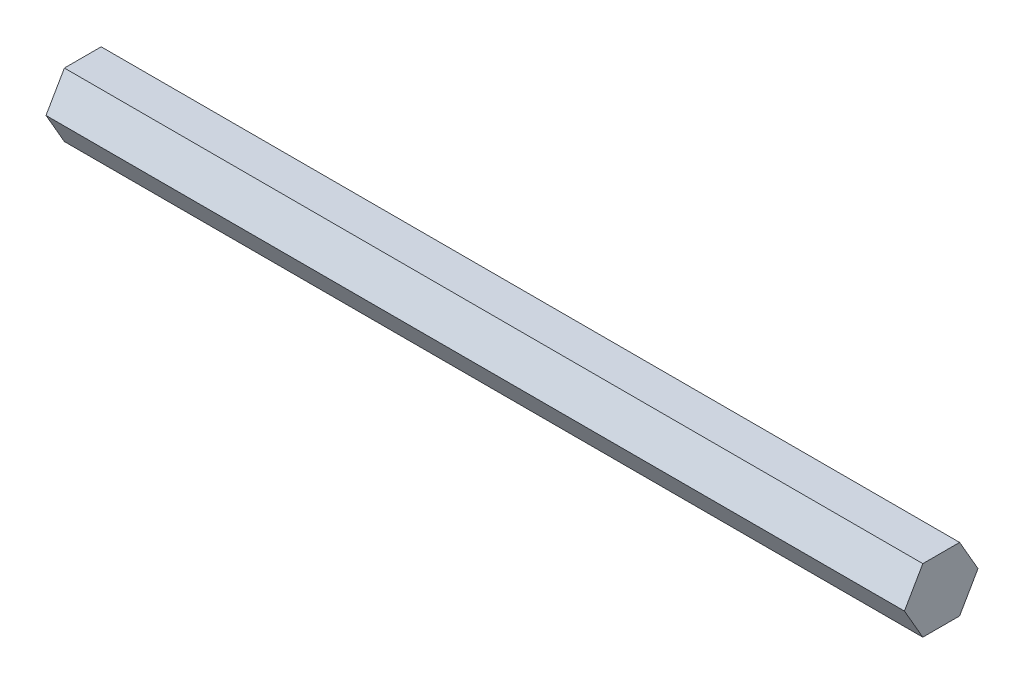
ISO-10303-21;
HEADER;
FILE_DESCRIPTION(('STEP AP214'),'2;1');
FILE_NAME('part.step','',(''),(''),'','','');
FILE_SCHEMA(('AUTOMOTIVE_DESIGN { 1 0 10303 214 1 1 1 1 }'));
ENDSEC;
DATA;
#1=APPLICATION_CONTEXT('core data for automotive mechanical design processes');
#2=APPLICATION_PROTOCOL_DEFINITION('international standard','automotive_design',2000,#1);
#3=PRODUCT_CONTEXT('',#1,'mechanical');
#4=PRODUCT('Part','Part','',(#3));
#5=PRODUCT_RELATED_PRODUCT_CATEGORY('part','',(#4));
#6=PRODUCT_DEFINITION_FORMATION('','',#4);
#7=PRODUCT_DEFINITION_CONTEXT('part definition',#1,'design');
#8=PRODUCT_DEFINITION('design','',#6,#7);
#9=PRODUCT_DEFINITION_SHAPE('','',#8);
#10=(LENGTH_UNIT() NAMED_UNIT(*) SI_UNIT(.MILLI.,.METRE.));
#11=(NAMED_UNIT(*) PLANE_ANGLE_UNIT() SI_UNIT($,.RADIAN.));
#12=(NAMED_UNIT(*) SI_UNIT($,.STERADIAN.) SOLID_ANGLE_UNIT());
#13=UNCERTAINTY_MEASURE_WITH_UNIT(LENGTH_MEASURE(1.E-05),#10,'distance_accuracy_value','');
#14=(GEOMETRIC_REPRESENTATION_CONTEXT(3) GLOBAL_UNCERTAINTY_ASSIGNED_CONTEXT((#13)) GLOBAL_UNIT_ASSIGNED_CONTEXT((#10,
#11,#12)) REPRESENTATION_CONTEXT('',''));
#15=CARTESIAN_POINT('',(0.,0.,0.));
#16=DIRECTION('',(0.,0.,1.));
#17=DIRECTION('',(1.,0.,0.));
#18=AXIS2_PLACEMENT_3D('',#15,#16,#17);
#19=CARTESIAN_POINT('',(171.45,-6.3627,-3.67350655777283));
#20=DIRECTION('',(0.,0.5,0.866025403784439));
#21=DIRECTION('',(0.,-0.866025403784439,0.5));
#22=AXIS2_PLACEMENT_3D('',#19,#20,#21);
#23=PLANE('',#22);
#24=DIRECTION('',(0.,0.866025403784439,-0.5));
#25=VECTOR('',#24,1.);
#26=CARTESIAN_POINT('',(0.,-6.3627,-3.67350655777283));
#27=LINE('',#26,#25);
#28=CARTESIAN_POINT('',(0.,-6.3627,-3.67350655777283));
#29=VERTEX_POINT('',#28);
#30=CARTESIAN_POINT('',(0.,0.,-7.34701311554566));
#31=VERTEX_POINT('',#30);
#32=EDGE_CURVE('E116',#29,#31,#27,.T.);
#33=ORIENTED_EDGE('',*,*,#32,.T.);
#34=DIRECTION('',(-1.,0.,0.));
#35=VECTOR('',#34,1.);
#36=CARTESIAN_POINT('',(171.45,0.,-7.34701311554566));
#37=LINE('',#36,#35);
#38=CARTESIAN_POINT('',(171.45,0.,-7.34701311554566));
#39=VERTEX_POINT('',#38);
#40=EDGE_CURVE('E11',#39,#31,#37,.T.);
#41=ORIENTED_EDGE('',*,*,#40,.F.);
#42=DIRECTION('',(0.,0.866025403784439,-0.5));
#43=VECTOR('',#42,1.);
#44=CARTESIAN_POINT('',(171.45,-6.3627,-3.67350655777283));
#45=LINE('',#44,#43);
#46=CARTESIAN_POINT('',(171.45,-6.3627,-3.67350655777283));
#47=VERTEX_POINT('',#46);
#48=EDGE_CURVE('E126',#47,#39,#45,.T.);
#49=ORIENTED_EDGE('',*,*,#48,.F.);
#50=DIRECTION('',(-1.,0.,0.));
#51=VECTOR('',#50,1.);
#52=CARTESIAN_POINT('',(171.45,-6.3627,-3.67350655777283));
#53=LINE('',#52,#51);
#54=EDGE_CURVE('E112',#47,#29,#53,.T.);
#55=ORIENTED_EDGE('',*,*,#54,.T.);
#56=EDGE_LOOP('',(#33,#41,#49,#55));
#57=FACE_BOUND('',#56,.T.);
#58=ADVANCED_FACE('F32',(#57),#23,.F.);
#59=CARTESIAN_POINT('',(171.45,0.,-7.34701311554566));
#60=DIRECTION('',(0.,-0.5,0.866025403784439));
#61=DIRECTION('',(0.,-0.866025403784439,-0.5));
#62=AXIS2_PLACEMENT_3D('',#59,#60,#61);
#63=PLANE('',#62);
#64=DIRECTION('',(0.,0.866025403784439,0.5));
#65=VECTOR('',#64,1.);
#66=CARTESIAN_POINT('',(0.,0.,-7.34701311554566));
#67=LINE('',#66,#65);
#68=CARTESIAN_POINT('',(0.,6.3627,-3.67350655777283));
#69=VERTEX_POINT('',#68);
#70=EDGE_CURVE('E119',#31,#69,#67,.T.);
#71=ORIENTED_EDGE('',*,*,#70,.T.);
#72=DIRECTION('',(-1.,0.,0.));
#73=VECTOR('',#72,1.);
#74=CARTESIAN_POINT('',(171.45,6.3627,-3.67350655777283));
#75=LINE('',#74,#73);
#76=CARTESIAN_POINT('',(171.45,6.3627,-3.67350655777283));
#77=VERTEX_POINT('',#76);
#78=EDGE_CURVE('E40',#77,#69,#75,.T.);
#79=ORIENTED_EDGE('',*,*,#78,.F.);
#80=DIRECTION('',(0.,0.866025403784439,0.5));
#81=VECTOR('',#80,1.);
#82=CARTESIAN_POINT('',(171.45,0.,-7.34701311554566));
#83=LINE('',#82,#81);
#84=EDGE_CURVE('E85',#39,#77,#83,.T.);
#85=ORIENTED_EDGE('',*,*,#84,.F.);
#86=ORIENTED_EDGE('',*,*,#40,.T.);
#87=EDGE_LOOP('',(#71,#79,#85,#86));
#88=FACE_BOUND('',#87,.T.);
#89=ADVANCED_FACE('F150',(#88),#63,.F.);
#90=CARTESIAN_POINT('',(171.45,6.3627,-3.67350655777283));
#91=DIRECTION('',(0.,-1.,0.));
#92=DIRECTION('',(0.,0.,-1.));
#93=AXIS2_PLACEMENT_3D('',#90,#91,#92);
#94=PLANE('',#93);
#95=DIRECTION('',(0.,0.,1.));
#96=VECTOR('',#95,1.);
#97=CARTESIAN_POINT('',(0.,6.3627,-3.67350655777283));
#98=LINE('',#97,#96);
#99=CARTESIAN_POINT('',(0.,6.3627,3.67350655777283));
#100=VERTEX_POINT('',#99);
#101=EDGE_CURVE('E121',#69,#100,#98,.T.);
#102=ORIENTED_EDGE('',*,*,#101,.T.);
#103=DIRECTION('',(-1.,0.,0.));
#104=VECTOR('',#103,1.);
#105=CARTESIAN_POINT('',(171.45,6.3627,3.67350655777283));
#106=LINE('',#105,#104);
#107=CARTESIAN_POINT('',(171.45,6.3627,3.67350655777283));
#108=VERTEX_POINT('',#107);
#109=EDGE_CURVE('E107',#108,#100,#106,.T.);
#110=ORIENTED_EDGE('',*,*,#109,.F.);
#111=DIRECTION('',(0.,0.,1.));
#112=VECTOR('',#111,1.);
#113=CARTESIAN_POINT('',(171.45,6.3627,-3.67350655777283));
#114=LINE('',#113,#112);
#115=EDGE_CURVE('E98',#77,#108,#114,.T.);
#116=ORIENTED_EDGE('',*,*,#115,.F.);
#117=ORIENTED_EDGE('',*,*,#78,.T.);
#118=EDGE_LOOP('',(#102,#110,#116,#117));
#119=FACE_BOUND('',#118,.T.);
#120=ADVANCED_FACE('F132',(#119),#94,.F.);
#121=CARTESIAN_POINT('',(171.45,6.3627,3.67350655777283));
#122=DIRECTION('',(0.,-0.5,-0.866025403784439));
#123=DIRECTION('',(0.,0.866025403784439,-0.5));
#124=AXIS2_PLACEMENT_3D('',#121,#122,#123);
#125=PLANE('',#124);
#126=DIRECTION('',(0.,-0.866025403784439,0.5));
#127=VECTOR('',#126,1.);
#128=CARTESIAN_POINT('',(0.,6.3627,3.67350655777283));
#129=LINE('',#128,#127);
#130=CARTESIAN_POINT('',(0.,0.,7.34701311554567));
#131=VERTEX_POINT('',#130);
#132=EDGE_CURVE('E106',#100,#131,#129,.T.);
#133=ORIENTED_EDGE('',*,*,#132,.T.);
#134=DIRECTION('',(-1.,0.,0.));
#135=VECTOR('',#134,1.);
#136=CARTESIAN_POINT('',(171.45,0.,7.34701311554567));
#137=LINE('',#136,#135);
#138=CARTESIAN_POINT('',(171.45,0.,7.34701311554567));
#139=VERTEX_POINT('',#138);
#140=EDGE_CURVE('E103',#139,#131,#137,.T.);
#141=ORIENTED_EDGE('',*,*,#140,.F.);
#142=DIRECTION('',(0.,-0.866025403784439,0.5));
#143=VECTOR('',#142,1.);
#144=CARTESIAN_POINT('',(171.45,6.3627,3.67350655777283));
#145=LINE('',#144,#143);
#146=EDGE_CURVE('E92',#108,#139,#145,.T.);
#147=ORIENTED_EDGE('',*,*,#146,.F.);
#148=ORIENTED_EDGE('',*,*,#109,.T.);
#149=EDGE_LOOP('',(#133,#141,#147,#148));
#150=FACE_BOUND('',#149,.T.);
#151=ADVANCED_FACE('F104',(#150),#125,.F.);
#152=CARTESIAN_POINT('',(171.45,0.,7.34701311554567));
#153=DIRECTION('',(0.,0.5,-0.866025403784439));
#154=DIRECTION('',(0.,0.866025403784439,0.5));
#155=AXIS2_PLACEMENT_3D('',#152,#153,#154);
#156=PLANE('',#155);
#157=DIRECTION('',(0.,-0.866025403784439,-0.5));
#158=VECTOR('',#157,1.);
#159=CARTESIAN_POINT('',(0.,0.,7.34701311554567));
#160=LINE('',#159,#158);
#161=CARTESIAN_POINT('',(0.,-6.3627,3.67350655777283));
#162=VERTEX_POINT('',#161);
#163=EDGE_CURVE('E71',#131,#162,#160,.T.);
#164=ORIENTED_EDGE('',*,*,#163,.T.);
#165=DIRECTION('',(-1.,0.,0.));
#166=VECTOR('',#165,1.);
#167=CARTESIAN_POINT('',(171.45,-6.3627,3.67350655777283));
#168=LINE('',#167,#166);
#169=CARTESIAN_POINT('',(171.45,-6.3627,3.67350655777283));
#170=VERTEX_POINT('',#169);
#171=EDGE_CURVE('E108',#170,#162,#168,.T.);
#172=ORIENTED_EDGE('',*,*,#171,.F.);
#173=DIRECTION('',(0.,-0.866025403784439,-0.5));
#174=VECTOR('',#173,1.);
#175=CARTESIAN_POINT('',(171.45,0.,7.34701311554567));
#176=LINE('',#175,#174);
#177=EDGE_CURVE('E96',#139,#170,#176,.T.);
#178=ORIENTED_EDGE('',*,*,#177,.F.);
#179=ORIENTED_EDGE('',*,*,#140,.T.);
#180=EDGE_LOOP('',(#164,#172,#178,#179));
#181=FACE_BOUND('',#180,.T.);
#182=ADVANCED_FACE('F110',(#181),#156,.F.);
#183=CARTESIAN_POINT('',(171.45,-6.3627,3.67350655777283));
#184=DIRECTION('',(0.,1.,0.));
#185=DIRECTION('',(0.,0.,1.));
#186=AXIS2_PLACEMENT_3D('',#183,#184,#185);
#187=PLANE('',#186);
#188=DIRECTION('',(0.,0.,-1.));
#189=VECTOR('',#188,1.);
#190=CARTESIAN_POINT('',(0.,-6.3627,3.67350655777283));
#191=LINE('',#190,#189);
#192=EDGE_CURVE('E77',#162,#29,#191,.T.);
#193=ORIENTED_EDGE('',*,*,#192,.T.);
#194=ORIENTED_EDGE('',*,*,#54,.F.);
#195=DIRECTION('',(0.,0.,-1.));
#196=VECTOR('',#195,1.);
#197=CARTESIAN_POINT('',(171.45,-6.3627,3.67350655777283));
#198=LINE('',#197,#196);
#199=EDGE_CURVE('E48',#170,#47,#198,.T.);
#200=ORIENTED_EDGE('',*,*,#199,.F.);
#201=ORIENTED_EDGE('',*,*,#171,.T.);
#202=EDGE_LOOP('',(#193,#194,#200,#201));
#203=FACE_BOUND('',#202,.T.);
#204=ADVANCED_FACE('F139',(#203),#187,.F.);
#205=CARTESIAN_POINT('',(171.45,0.,0.));
#206=DIRECTION('',(1.,0.,0.));
#207=DIRECTION('',(0.,0.,-1.));
#208=AXIS2_PLACEMENT_3D('',#205,#206,#207);
#209=PLANE('',#208);
#210=ORIENTED_EDGE('',*,*,#48,.T.);
#211=ORIENTED_EDGE('',*,*,#84,.T.);
#212=ORIENTED_EDGE('',*,*,#115,.T.);
#213=ORIENTED_EDGE('',*,*,#146,.T.);
#214=ORIENTED_EDGE('',*,*,#177,.T.);
#215=ORIENTED_EDGE('',*,*,#199,.T.);
#216=EDGE_LOOP('',(#210,#211,#212,#213,#214,#215));
#217=FACE_BOUND('',#216,.T.);
#218=ADVANCED_FACE('F94',(#217),#209,.T.);
#219=CARTESIAN_POINT('',(0.,0.,0.));
#220=DIRECTION('',(1.,0.,0.));
#221=DIRECTION('',(0.,0.,-1.));
#222=AXIS2_PLACEMENT_3D('',#219,#220,#221);
#223=PLANE('',#222);
#224=ORIENTED_EDGE('',*,*,#32,.F.);
#225=ORIENTED_EDGE('',*,*,#192,.F.);
#226=ORIENTED_EDGE('',*,*,#163,.F.);
#227=ORIENTED_EDGE('',*,*,#132,.F.);
#228=ORIENTED_EDGE('',*,*,#101,.F.);
#229=ORIENTED_EDGE('',*,*,#70,.F.);
#230=EDGE_LOOP('',(#224,#225,#226,#227,#228,#229));
#231=FACE_BOUND('',#230,.T.);
#232=ADVANCED_FACE('F135',(#231),#223,.F.);
#233=CLOSED_SHELL('',(#58,#89,#120,#151,#182,#204,#218,#232));
#234=MANIFOLD_SOLID_BREP('B2',#233);
#235=ADVANCED_BREP_SHAPE_REPRESENTATION('',(#18,#234),#14);
#236=SHAPE_DEFINITION_REPRESENTATION(#9,#235);
ENDSEC;
END-ISO-10303-21;
